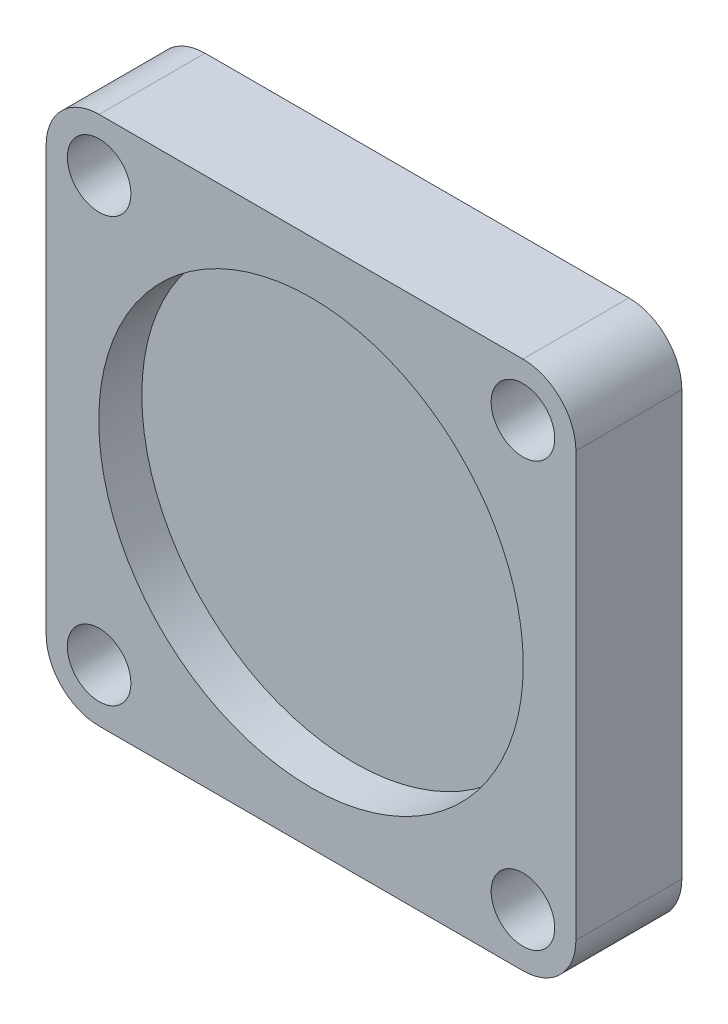
ISO-10303-21;
HEADER;
FILE_DESCRIPTION(('STEP AP214'),'2;1');
FILE_NAME('part.step','',(''),(''),'','','');
FILE_SCHEMA(('AUTOMOTIVE_DESIGN { 1 0 10303 214 1 1 1 1 }'));
ENDSEC;
DATA;
#1=APPLICATION_CONTEXT('core data for automotive mechanical design processes');
#2=APPLICATION_PROTOCOL_DEFINITION('international standard','automotive_design',2000,#1);
#3=PRODUCT_CONTEXT('',#1,'mechanical');
#4=PRODUCT('Part','Part','',(#3));
#5=PRODUCT_RELATED_PRODUCT_CATEGORY('part','',(#4));
#6=PRODUCT_DEFINITION_FORMATION('','',#4);
#7=PRODUCT_DEFINITION_CONTEXT('part definition',#1,'design');
#8=PRODUCT_DEFINITION('design','',#6,#7);
#9=PRODUCT_DEFINITION_SHAPE('','',#8);
#10=(LENGTH_UNIT() NAMED_UNIT(*) SI_UNIT(.MILLI.,.METRE.));
#11=(NAMED_UNIT(*) PLANE_ANGLE_UNIT() SI_UNIT($,.RADIAN.));
#12=(NAMED_UNIT(*) SI_UNIT($,.STERADIAN.) SOLID_ANGLE_UNIT());
#13=UNCERTAINTY_MEASURE_WITH_UNIT(LENGTH_MEASURE(1.E-05),#10,'distance_accuracy_value','');
#14=(GEOMETRIC_REPRESENTATION_CONTEXT(3) GLOBAL_UNCERTAINTY_ASSIGNED_CONTEXT((#13)) GLOBAL_UNIT_ASSIGNED_CONTEXT((#10,
#11,#12)) REPRESENTATION_CONTEXT('',''));
#15=CARTESIAN_POINT('',(0.,0.,0.));
#16=DIRECTION('',(0.,0.,1.));
#17=DIRECTION('',(1.,0.,0.));
#18=AXIS2_PLACEMENT_3D('',#15,#16,#17);
#19=CARTESIAN_POINT('',(10.,-10.,5.));
#20=DIRECTION('',(0.,0.,1.));
#21=DIRECTION('',(1.,0.,0.));
#22=AXIS2_PLACEMENT_3D('',#19,#20,#21);
#23=PLANE('',#22);
#24=CARTESIAN_POINT('',(0.,0.,5.));
#25=DIRECTION('',(0.,0.,1.));
#26=DIRECTION('',(1.,0.,0.));
#27=AXIS2_PLACEMENT_3D('',#24,#25,#26);
#28=CIRCLE('',#27,10.015);
#29=CARTESIAN_POINT('',(10.015,0.,5.));
#30=VERTEX_POINT('',#29);
#31=EDGE_CURVE('E241',#30,#30,#28,.T.);
#32=ORIENTED_EDGE('',*,*,#31,.F.);
#33=EDGE_LOOP('',(#32));
#34=FACE_BOUND('',#33,.T.);
#35=CARTESIAN_POINT('',(10.0000000000006,-9.99999999999944,5.));
#36=DIRECTION('',(0.,0.,1.));
#37=DIRECTION('',(1.,0.,0.));
#38=AXIS2_PLACEMENT_3D('',#35,#36,#37);
#39=CIRCLE('',#38,1.50000000000079);
#40=CARTESIAN_POINT('',(11.5000000000014,-9.99999999999944,5.));
#41=VERTEX_POINT('',#40);
#42=EDGE_CURVE('E221',#41,#41,#39,.T.);
#43=ORIENTED_EDGE('',*,*,#42,.F.);
#44=EDGE_LOOP('',(#43));
#45=FACE_BOUND('',#44,.T.);
#46=CARTESIAN_POINT('',(-10.,10.,5.));
#47=DIRECTION('',(0.,0.,1.));
#48=DIRECTION('',(1.,0.,0.));
#49=AXIS2_PLACEMENT_3D('',#46,#47,#48);
#50=CIRCLE('',#49,1.5);
#51=CARTESIAN_POINT('',(-8.5,10.,5.));
#52=VERTEX_POINT('',#51);
#53=EDGE_CURVE('E146',#52,#52,#50,.T.);
#54=ORIENTED_EDGE('',*,*,#53,.F.);
#55=EDGE_LOOP('',(#54));
#56=FACE_BOUND('',#55,.T.);
#57=CARTESIAN_POINT('',(10.,-10.,5.));
#58=DIRECTION('',(0.,0.,1.));
#59=DIRECTION('',(1.,0.,0.));
#60=AXIS2_PLACEMENT_3D('',#57,#58,#59);
#61=CIRCLE('',#60,2.5);
#62=CARTESIAN_POINT('',(9.99999999999998,-12.5,5.));
#63=VERTEX_POINT('',#62);
#64=CARTESIAN_POINT('',(12.5,-9.99999999999998,5.));
#65=VERTEX_POINT('',#64);
#66=EDGE_CURVE('E164',#63,#65,#61,.T.);
#67=ORIENTED_EDGE('',*,*,#66,.T.);
#68=DIRECTION('',(0.,1.,0.));
#69=VECTOR('',#68,1.);
#70=CARTESIAN_POINT('',(12.5,9.99999999999998,5.));
#71=LINE('',#70,#69);
#72=CARTESIAN_POINT('',(12.5,9.99999999999998,5.));
#73=VERTEX_POINT('',#72);
#74=EDGE_CURVE('E100',#65,#73,#71,.T.);
#75=ORIENTED_EDGE('',*,*,#74,.T.);
#76=CARTESIAN_POINT('',(10.,10.,5.));
#77=DIRECTION('',(0.,0.,1.));
#78=DIRECTION('',(-1.,0.,0.));
#79=AXIS2_PLACEMENT_3D('',#76,#77,#78);
#80=CIRCLE('',#79,2.5);
#81=CARTESIAN_POINT('',(9.99999999999998,12.5,5.));
#82=VERTEX_POINT('',#81);
#83=EDGE_CURVE('E185',#73,#82,#80,.T.);
#84=ORIENTED_EDGE('',*,*,#83,.T.);
#85=DIRECTION('',(-1.,0.,0.));
#86=VECTOR('',#85,1.);
#87=CARTESIAN_POINT('',(-9.99999999999999,12.5,5.));
#88=LINE('',#87,#86);
#89=CARTESIAN_POINT('',(-9.99999999999999,12.5,5.));
#90=VERTEX_POINT('',#89);
#91=EDGE_CURVE('E199',#82,#90,#88,.T.);
#92=ORIENTED_EDGE('',*,*,#91,.T.);
#93=CARTESIAN_POINT('',(-10.,10.,5.));
#94=DIRECTION('',(0.,0.,1.));
#95=DIRECTION('',(1.,0.,0.));
#96=AXIS2_PLACEMENT_3D('',#93,#94,#95);
#97=CIRCLE('',#96,2.5);
#98=CARTESIAN_POINT('',(-12.5,9.99999999999998,5.));
#99=VERTEX_POINT('',#98);
#100=EDGE_CURVE('E119',#90,#99,#97,.T.);
#101=ORIENTED_EDGE('',*,*,#100,.T.);
#102=DIRECTION('',(0.,-1.,0.));
#103=VECTOR('',#102,1.);
#104=CARTESIAN_POINT('',(-12.5,9.99999999999998,5.));
#105=LINE('',#104,#103);
#106=CARTESIAN_POINT('',(-12.5,-9.99999999999998,5.));
#107=VERTEX_POINT('',#106);
#108=EDGE_CURVE('E113',#99,#107,#105,.T.);
#109=ORIENTED_EDGE('',*,*,#108,.T.);
#110=CARTESIAN_POINT('',(-10.,-10.,5.));
#111=DIRECTION('',(0.,0.,1.));
#112=DIRECTION('',(1.,0.,0.));
#113=AXIS2_PLACEMENT_3D('',#110,#111,#112);
#114=CIRCLE('',#113,2.5);
#115=CARTESIAN_POINT('',(-9.99999999999998,-12.5,5.));
#116=VERTEX_POINT('',#115);
#117=EDGE_CURVE('E117',#107,#116,#114,.T.);
#118=ORIENTED_EDGE('',*,*,#117,.T.);
#119=DIRECTION('',(1.,0.,0.));
#120=VECTOR('',#119,1.);
#121=CARTESIAN_POINT('',(-9.99999999999998,-12.5,5.));
#122=LINE('',#121,#120);
#123=EDGE_CURVE('E57',#116,#63,#122,.T.);
#124=ORIENTED_EDGE('',*,*,#123,.T.);
#125=EDGE_LOOP('',(#67,#75,#84,#92,#101,#109,#118,#124));
#126=FACE_BOUND('',#125,.T.);
#127=CARTESIAN_POINT('',(10.,10.0000000000006,5.));
#128=DIRECTION('',(0.,0.,1.));
#129=DIRECTION('',(1.,0.,0.));
#130=AXIS2_PLACEMENT_3D('',#127,#128,#129);
#131=CIRCLE('',#130,1.50000000000058);
#132=CARTESIAN_POINT('',(11.5000000000006,10.0000000000006,5.));
#133=VERTEX_POINT('',#132);
#134=EDGE_CURVE('E213',#133,#133,#131,.T.);
#135=ORIENTED_EDGE('',*,*,#134,.F.);
#136=EDGE_LOOP('',(#135));
#137=FACE_BOUND('',#136,.T.);
#138=CARTESIAN_POINT('',(-9.99999999999944,-10.,5.));
#139=DIRECTION('',(0.,0.,1.));
#140=DIRECTION('',(1.,0.,0.));
#141=AXIS2_PLACEMENT_3D('',#138,#139,#140);
#142=CIRCLE('',#141,1.50000000000029);
#143=CARTESIAN_POINT('',(-8.49999999999914,-10.,5.));
#144=VERTEX_POINT('',#143);
#145=EDGE_CURVE('E229',#144,#144,#142,.T.);
#146=ORIENTED_EDGE('',*,*,#145,.F.);
#147=EDGE_LOOP('',(#146));
#148=FACE_BOUND('',#147,.T.);
#149=ADVANCED_FACE('F39',(#34,#45,#56,#126,#137,#148),#23,.T.);
#150=CARTESIAN_POINT('',(10.,-10.,0.));
#151=DIRECTION('',(0.,0.,1.));
#152=DIRECTION('',(1.,0.,0.));
#153=AXIS2_PLACEMENT_3D('',#150,#151,#152);
#154=PLANE('',#153);
#155=CARTESIAN_POINT('',(10.,-10.,0.));
#156=DIRECTION('',(0.,0.,1.));
#157=DIRECTION('',(1.,0.,0.));
#158=AXIS2_PLACEMENT_3D('',#155,#156,#157);
#159=CIRCLE('',#158,2.5);
#160=CARTESIAN_POINT('',(9.99999999999998,-12.5,0.));
#161=VERTEX_POINT('',#160);
#162=CARTESIAN_POINT('',(12.5,-9.99999999999998,0.));
#163=VERTEX_POINT('',#162);
#164=EDGE_CURVE('E141',#161,#163,#159,.T.);
#165=ORIENTED_EDGE('',*,*,#164,.F.);
#166=DIRECTION('',(1.,0.,0.));
#167=VECTOR('',#166,1.);
#168=CARTESIAN_POINT('',(-9.99999999999998,-12.5,0.));
#169=LINE('',#168,#167);
#170=CARTESIAN_POINT('',(-9.99999999999998,-12.5,0.));
#171=VERTEX_POINT('',#170);
#172=EDGE_CURVE('E92',#171,#161,#169,.T.);
#173=ORIENTED_EDGE('',*,*,#172,.F.);
#174=CARTESIAN_POINT('',(-10.,-10.,0.));
#175=DIRECTION('',(0.,0.,1.));
#176=DIRECTION('',(1.,0.,0.));
#177=AXIS2_PLACEMENT_3D('',#174,#175,#176);
#178=CIRCLE('',#177,2.5);
#179=CARTESIAN_POINT('',(-12.5,-9.99999999999998,0.));
#180=VERTEX_POINT('',#179);
#181=EDGE_CURVE('E86',#180,#171,#178,.T.);
#182=ORIENTED_EDGE('',*,*,#181,.F.);
#183=DIRECTION('',(0.,-1.,0.));
#184=VECTOR('',#183,1.);
#185=CARTESIAN_POINT('',(-12.5,9.99999999999998,0.));
#186=LINE('',#185,#184);
#187=CARTESIAN_POINT('',(-12.5,9.99999999999998,0.));
#188=VERTEX_POINT('',#187);
#189=EDGE_CURVE('E128',#188,#180,#186,.T.);
#190=ORIENTED_EDGE('',*,*,#189,.F.);
#191=CARTESIAN_POINT('',(-10.,10.,0.));
#192=DIRECTION('',(0.,0.,1.));
#193=DIRECTION('',(1.,0.,0.));
#194=AXIS2_PLACEMENT_3D('',#191,#192,#193);
#195=CIRCLE('',#194,2.5);
#196=CARTESIAN_POINT('',(-9.99999999999999,12.5,0.));
#197=VERTEX_POINT('',#196);
#198=EDGE_CURVE('E155',#197,#188,#195,.T.);
#199=ORIENTED_EDGE('',*,*,#198,.F.);
#200=DIRECTION('',(-1.,0.,0.));
#201=VECTOR('',#200,1.);
#202=CARTESIAN_POINT('',(-9.99999999999999,12.5,0.));
#203=LINE('',#202,#201);
#204=CARTESIAN_POINT('',(9.99999999999998,12.5,0.));
#205=VERTEX_POINT('',#204);
#206=EDGE_CURVE('E152',#205,#197,#203,.T.);
#207=ORIENTED_EDGE('',*,*,#206,.F.);
#208=CARTESIAN_POINT('',(10.,10.,0.));
#209=DIRECTION('',(0.,0.,1.));
#210=DIRECTION('',(-1.,0.,0.));
#211=AXIS2_PLACEMENT_3D('',#208,#209,#210);
#212=CIRCLE('',#211,2.5);
#213=CARTESIAN_POINT('',(12.5,9.99999999999998,0.));
#214=VERTEX_POINT('',#213);
#215=EDGE_CURVE('E149',#214,#205,#212,.T.);
#216=ORIENTED_EDGE('',*,*,#215,.F.);
#217=DIRECTION('',(0.,1.,0.));
#218=VECTOR('',#217,1.);
#219=CARTESIAN_POINT('',(12.5,9.99999999999998,0.));
#220=LINE('',#219,#218);
#221=EDGE_CURVE('E145',#163,#214,#220,.T.);
#222=ORIENTED_EDGE('',*,*,#221,.F.);
#223=EDGE_LOOP('',(#165,#173,#182,#190,#199,#207,#216,#222));
#224=FACE_BOUND('',#223,.T.);
#225=CARTESIAN_POINT('',(-10.,10.,0.));
#226=DIRECTION('',(0.,0.,1.));
#227=DIRECTION('',(1.,0.,0.));
#228=AXIS2_PLACEMENT_3D('',#225,#226,#227);
#229=CIRCLE('',#228,1.5);
#230=CARTESIAN_POINT('',(-8.5,10.,0.));
#231=VERTEX_POINT('',#230);
#232=EDGE_CURVE('E209',#231,#231,#229,.T.);
#233=ORIENTED_EDGE('',*,*,#232,.T.);
#234=EDGE_LOOP('',(#233));
#235=FACE_BOUND('',#234,.T.);
#236=CARTESIAN_POINT('',(10.,10.0000000000006,0.));
#237=DIRECTION('',(0.,0.,1.));
#238=DIRECTION('',(1.,0.,0.));
#239=AXIS2_PLACEMENT_3D('',#236,#237,#238);
#240=CIRCLE('',#239,1.50000000000058);
#241=CARTESIAN_POINT('',(11.5000000000006,10.0000000000006,0.));
#242=VERTEX_POINT('',#241);
#243=EDGE_CURVE('E217',#242,#242,#240,.T.);
#244=ORIENTED_EDGE('',*,*,#243,.T.);
#245=EDGE_LOOP('',(#244));
#246=FACE_BOUND('',#245,.T.);
#247=CARTESIAN_POINT('',(10.0000000000006,-9.99999999999944,0.));
#248=DIRECTION('',(0.,0.,1.));
#249=DIRECTION('',(1.,0.,0.));
#250=AXIS2_PLACEMENT_3D('',#247,#248,#249);
#251=CIRCLE('',#250,1.50000000000079);
#252=CARTESIAN_POINT('',(11.5000000000014,-9.99999999999944,0.));
#253=VERTEX_POINT('',#252);
#254=EDGE_CURVE('E225',#253,#253,#251,.T.);
#255=ORIENTED_EDGE('',*,*,#254,.T.);
#256=EDGE_LOOP('',(#255));
#257=FACE_BOUND('',#256,.T.);
#258=CARTESIAN_POINT('',(-9.99999999999944,-10.,0.));
#259=DIRECTION('',(0.,0.,1.));
#260=DIRECTION('',(1.,0.,0.));
#261=AXIS2_PLACEMENT_3D('',#258,#259,#260);
#262=CIRCLE('',#261,1.50000000000029);
#263=CARTESIAN_POINT('',(-8.49999999999914,-10.,0.));
#264=VERTEX_POINT('',#263);
#265=EDGE_CURVE('E233',#264,#264,#262,.T.);
#266=ORIENTED_EDGE('',*,*,#265,.T.);
#267=EDGE_LOOP('',(#266));
#268=FACE_BOUND('',#267,.T.);
#269=ADVANCED_FACE('F189',(#224,#235,#246,#257,#268),#154,.F.);
#270=CARTESIAN_POINT('',(10.,-10.,5.));
#271=DIRECTION('',(0.,0.,-1.));
#272=DIRECTION('',(-1.,0.,0.));
#273=AXIS2_PLACEMENT_3D('',#270,#271,#272);
#274=CYLINDRICAL_SURFACE('',#273,2.5);
#275=ORIENTED_EDGE('',*,*,#164,.T.);
#276=DIRECTION('',(0.,0.,-1.));
#277=VECTOR('',#276,1.);
#278=CARTESIAN_POINT('',(12.5,-9.99999999999998,5.));
#279=LINE('',#278,#277);
#280=EDGE_CURVE('E11',#65,#163,#279,.T.);
#281=ORIENTED_EDGE('',*,*,#280,.F.);
#282=ORIENTED_EDGE('',*,*,#66,.F.);
#283=DIRECTION('',(0.,0.,-1.));
#284=VECTOR('',#283,1.);
#285=CARTESIAN_POINT('',(9.99999999999998,-12.5,5.));
#286=LINE('',#285,#284);
#287=EDGE_CURVE('E137',#63,#161,#286,.T.);
#288=ORIENTED_EDGE('',*,*,#287,.T.);
#289=EDGE_LOOP('',(#275,#281,#282,#288));
#290=FACE_BOUND('',#289,.T.);
#291=ADVANCED_FACE('F41',(#290),#274,.T.);
#292=CARTESIAN_POINT('',(12.5,9.99999999999998,5.));
#293=DIRECTION('',(-1.,0.,0.));
#294=DIRECTION('',(0.,-1.,0.));
#295=AXIS2_PLACEMENT_3D('',#292,#293,#294);
#296=PLANE('',#295);
#297=ORIENTED_EDGE('',*,*,#221,.T.);
#298=DIRECTION('',(0.,0.,-1.));
#299=VECTOR('',#298,1.);
#300=CARTESIAN_POINT('',(12.5,9.99999999999998,5.));
#301=LINE('',#300,#299);
#302=EDGE_CURVE('E49',#73,#214,#301,.T.);
#303=ORIENTED_EDGE('',*,*,#302,.F.);
#304=ORIENTED_EDGE('',*,*,#74,.F.);
#305=ORIENTED_EDGE('',*,*,#280,.T.);
#306=EDGE_LOOP('',(#297,#303,#304,#305));
#307=FACE_BOUND('',#306,.T.);
#308=ADVANCED_FACE('F306',(#307),#296,.F.);
#309=CARTESIAN_POINT('',(10.,10.,5.));
#310=DIRECTION('',(0.,0.,-1.));
#311=DIRECTION('',(-1.,0.,0.));
#312=AXIS2_PLACEMENT_3D('',#309,#310,#311);
#313=CYLINDRICAL_SURFACE('',#312,2.5);
#314=ORIENTED_EDGE('',*,*,#215,.T.);
#315=DIRECTION('',(0.,0.,-1.));
#316=VECTOR('',#315,1.);
#317=CARTESIAN_POINT('',(9.99999999999998,12.5,5.));
#318=LINE('',#317,#316);
#319=EDGE_CURVE('E175',#82,#205,#318,.T.);
#320=ORIENTED_EDGE('',*,*,#319,.F.);
#321=ORIENTED_EDGE('',*,*,#83,.F.);
#322=ORIENTED_EDGE('',*,*,#302,.T.);
#323=EDGE_LOOP('',(#314,#320,#321,#322));
#324=FACE_BOUND('',#323,.T.);
#325=ADVANCED_FACE('F183',(#324),#313,.T.);
#326=CARTESIAN_POINT('',(-9.99999999999999,12.5,5.));
#327=DIRECTION('',(0.,-1.,0.));
#328=DIRECTION('',(0.,0.,-1.));
#329=AXIS2_PLACEMENT_3D('',#326,#327,#328);
#330=PLANE('',#329);
#331=ORIENTED_EDGE('',*,*,#206,.T.);
#332=DIRECTION('',(0.,0.,-1.));
#333=VECTOR('',#332,1.);
#334=CARTESIAN_POINT('',(-9.99999999999999,12.5,5.));
#335=LINE('',#334,#333);
#336=EDGE_CURVE('E171',#90,#197,#335,.T.);
#337=ORIENTED_EDGE('',*,*,#336,.F.);
#338=ORIENTED_EDGE('',*,*,#91,.F.);
#339=ORIENTED_EDGE('',*,*,#319,.T.);
#340=EDGE_LOOP('',(#331,#337,#338,#339));
#341=FACE_BOUND('',#340,.T.);
#342=ADVANCED_FACE('F194',(#341),#330,.F.);
#343=CARTESIAN_POINT('',(-10.,10.,5.));
#344=DIRECTION('',(0.,0.,-1.));
#345=DIRECTION('',(-1.,0.,0.));
#346=AXIS2_PLACEMENT_3D('',#343,#344,#345);
#347=CYLINDRICAL_SURFACE('',#346,2.5);
#348=ORIENTED_EDGE('',*,*,#198,.T.);
#349=DIRECTION('',(0.,0.,-1.));
#350=VECTOR('',#349,1.);
#351=CARTESIAN_POINT('',(-12.5,9.99999999999998,5.));
#352=LINE('',#351,#350);
#353=EDGE_CURVE('E130',#99,#188,#352,.T.);
#354=ORIENTED_EDGE('',*,*,#353,.F.);
#355=ORIENTED_EDGE('',*,*,#100,.F.);
#356=ORIENTED_EDGE('',*,*,#336,.T.);
#357=EDGE_LOOP('',(#348,#354,#355,#356));
#358=FACE_BOUND('',#357,.T.);
#359=ADVANCED_FACE('F197',(#358),#347,.T.);
#360=CARTESIAN_POINT('',(-12.5,9.99999999999998,5.));
#361=DIRECTION('',(1.,0.,0.));
#362=DIRECTION('',(0.,1.,0.));
#363=AXIS2_PLACEMENT_3D('',#360,#361,#362);
#364=PLANE('',#363);
#365=ORIENTED_EDGE('',*,*,#189,.T.);
#366=DIRECTION('',(0.,0.,-1.));
#367=VECTOR('',#366,1.);
#368=CARTESIAN_POINT('',(-12.5,-9.99999999999998,5.));
#369=LINE('',#368,#367);
#370=EDGE_CURVE('E125',#107,#180,#369,.T.);
#371=ORIENTED_EDGE('',*,*,#370,.F.);
#372=ORIENTED_EDGE('',*,*,#108,.F.);
#373=ORIENTED_EDGE('',*,*,#353,.T.);
#374=EDGE_LOOP('',(#365,#371,#372,#373));
#375=FACE_BOUND('',#374,.T.);
#376=ADVANCED_FACE('F126',(#375),#364,.F.);
#377=CARTESIAN_POINT('',(-10.,-10.,5.));
#378=DIRECTION('',(0.,0.,-1.));
#379=DIRECTION('',(-1.,0.,0.));
#380=AXIS2_PLACEMENT_3D('',#377,#378,#379);
#381=CYLINDRICAL_SURFACE('',#380,2.5);
#382=ORIENTED_EDGE('',*,*,#181,.T.);
#383=DIRECTION('',(0.,0.,-1.));
#384=VECTOR('',#383,1.);
#385=CARTESIAN_POINT('',(-9.99999999999998,-12.5,5.));
#386=LINE('',#385,#384);
#387=EDGE_CURVE('E131',#116,#171,#386,.T.);
#388=ORIENTED_EDGE('',*,*,#387,.F.);
#389=ORIENTED_EDGE('',*,*,#117,.F.);
#390=ORIENTED_EDGE('',*,*,#370,.T.);
#391=EDGE_LOOP('',(#382,#388,#389,#390));
#392=FACE_BOUND('',#391,.T.);
#393=ADVANCED_FACE('F133',(#392),#381,.T.);
#394=CARTESIAN_POINT('',(-9.99999999999998,-12.5,5.));
#395=DIRECTION('',(0.,1.,0.));
#396=DIRECTION('',(0.,0.,1.));
#397=AXIS2_PLACEMENT_3D('',#394,#395,#396);
#398=PLANE('',#397);
#399=ORIENTED_EDGE('',*,*,#172,.T.);
#400=ORIENTED_EDGE('',*,*,#287,.F.);
#401=ORIENTED_EDGE('',*,*,#123,.F.);
#402=ORIENTED_EDGE('',*,*,#387,.T.);
#403=EDGE_LOOP('',(#399,#400,#401,#402));
#404=FACE_BOUND('',#403,.T.);
#405=ADVANCED_FACE('F269',(#404),#398,.F.);
#406=CARTESIAN_POINT('',(-10.,10.,5.));
#407=DIRECTION('',(0.,0.,-1.));
#408=DIRECTION('',(-1.,0.,0.));
#409=AXIS2_PLACEMENT_3D('',#406,#407,#408);
#410=CYLINDRICAL_SURFACE('',#409,1.5);
#411=ORIENTED_EDGE('',*,*,#53,.T.);
#412=EDGE_LOOP('',(#411));
#413=FACE_BOUND('',#412,.T.);
#414=ORIENTED_EDGE('',*,*,#232,.F.);
#415=EDGE_LOOP('',(#414));
#416=FACE_BOUND('',#415,.T.);
#417=ADVANCED_FACE('F265',(#413,#416),#410,.F.);
#418=CARTESIAN_POINT('',(10.,10.0000000000006,5.));
#419=DIRECTION('',(0.,0.,-1.));
#420=DIRECTION('',(-1.,0.,0.));
#421=AXIS2_PLACEMENT_3D('',#418,#419,#420);
#422=CYLINDRICAL_SURFACE('',#421,1.50000000000058);
#423=ORIENTED_EDGE('',*,*,#134,.T.);
#424=EDGE_LOOP('',(#423));
#425=FACE_BOUND('',#424,.T.);
#426=ORIENTED_EDGE('',*,*,#243,.F.);
#427=EDGE_LOOP('',(#426));
#428=FACE_BOUND('',#427,.T.);
#429=ADVANCED_FACE('F268',(#425,#428),#422,.F.);
#430=CARTESIAN_POINT('',(10.0000000000006,-9.99999999999944,5.));
#431=DIRECTION('',(0.,0.,-1.));
#432=DIRECTION('',(-1.,0.,0.));
#433=AXIS2_PLACEMENT_3D('',#430,#431,#432);
#434=CYLINDRICAL_SURFACE('',#433,1.50000000000079);
#435=ORIENTED_EDGE('',*,*,#42,.T.);
#436=EDGE_LOOP('',(#435));
#437=FACE_BOUND('',#436,.T.);
#438=ORIENTED_EDGE('',*,*,#254,.F.);
#439=EDGE_LOOP('',(#438));
#440=FACE_BOUND('',#439,.T.);
#441=ADVANCED_FACE('F282',(#437,#440),#434,.F.);
#442=CARTESIAN_POINT('',(-9.99999999999944,-10.,5.));
#443=DIRECTION('',(0.,0.,-1.));
#444=DIRECTION('',(-1.,0.,0.));
#445=AXIS2_PLACEMENT_3D('',#442,#443,#444);
#446=CYLINDRICAL_SURFACE('',#445,1.50000000000029);
#447=ORIENTED_EDGE('',*,*,#145,.T.);
#448=EDGE_LOOP('',(#447));
#449=FACE_BOUND('',#448,.T.);
#450=ORIENTED_EDGE('',*,*,#265,.F.);
#451=EDGE_LOOP('',(#450));
#452=FACE_BOUND('',#451,.T.);
#453=ADVANCED_FACE('F254',(#449,#452),#446,.F.);
#454=CARTESIAN_POINT('',(0.,0.,2.97));
#455=DIRECTION('',(0.,0.,1.));
#456=DIRECTION('',(1.,0.,0.));
#457=AXIS2_PLACEMENT_3D('',#454,#455,#456);
#458=CYLINDRICAL_SURFACE('',#457,10.015);
#459=CARTESIAN_POINT('',(0.,0.,2.97));
#460=DIRECTION('',(0.,0.,1.));
#461=DIRECTION('',(1.,0.,0.));
#462=AXIS2_PLACEMENT_3D('',#459,#460,#461);
#463=CIRCLE('',#462,10.015);
#464=CARTESIAN_POINT('',(10.015,0.,2.97));
#465=VERTEX_POINT('',#464);
#466=EDGE_CURVE('E237',#465,#465,#463,.T.);
#467=ORIENTED_EDGE('',*,*,#466,.F.);
#468=EDGE_LOOP('',(#467));
#469=FACE_BOUND('',#468,.T.);
#470=ORIENTED_EDGE('',*,*,#31,.T.);
#471=EDGE_LOOP('',(#470));
#472=FACE_BOUND('',#471,.T.);
#473=ADVANCED_FACE('F251',(#469,#472),#458,.F.);
#474=CARTESIAN_POINT('',(0.,0.,2.97));
#475=DIRECTION('',(0.,0.,1.));
#476=DIRECTION('',(1.,0.,0.));
#477=AXIS2_PLACEMENT_3D('',#474,#475,#476);
#478=PLANE('',#477);
#479=ORIENTED_EDGE('',*,*,#466,.T.);
#480=EDGE_LOOP('',(#479));
#481=FACE_BOUND('',#480,.T.);
#482=ADVANCED_FACE('F249',(#481),#478,.T.);
#483=CLOSED_SHELL('',(#149,#269,#291,#308,#325,#342,#359,#376,#393,#405,#417,#429,#441,#453,
#473,#482));
#484=MANIFOLD_SOLID_BREP('B2',#483);
#485=ADVANCED_BREP_SHAPE_REPRESENTATION('',(#18,#484),#14);
#486=SHAPE_DEFINITION_REPRESENTATION(#9,#485);
ENDSEC;
END-ISO-10303-21;
